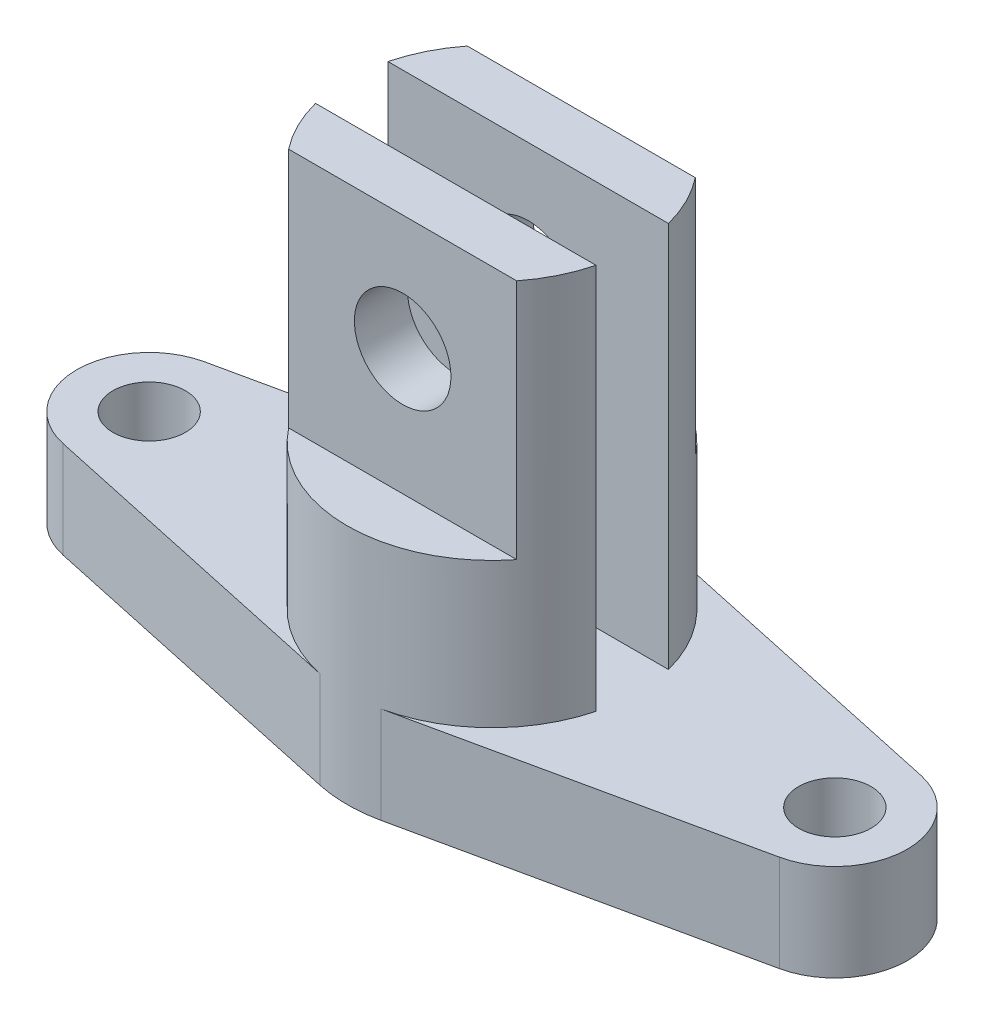
ISO-10303-21;
HEADER;
FILE_DESCRIPTION(('STEP AP214'),'2;1');
FILE_NAME('part.step','',(''),(''),'','','');
FILE_SCHEMA(('AUTOMOTIVE_DESIGN { 1 0 10303 214 1 1 1 1 }'));
ENDSEC;
DATA;
#1=APPLICATION_CONTEXT('core data for automotive mechanical design processes');
#2=APPLICATION_PROTOCOL_DEFINITION('international standard','automotive_design',2000,#1);
#3=PRODUCT_CONTEXT('',#1,'mechanical');
#4=PRODUCT('Part','Part','',(#3));
#5=PRODUCT_RELATED_PRODUCT_CATEGORY('part','',(#4));
#6=PRODUCT_DEFINITION_FORMATION('','',#4);
#7=PRODUCT_DEFINITION_CONTEXT('part definition',#1,'design');
#8=PRODUCT_DEFINITION('design','',#6,#7);
#9=PRODUCT_DEFINITION_SHAPE('','',#8);
#10=(LENGTH_UNIT() NAMED_UNIT(*) SI_UNIT(.MILLI.,.METRE.));
#11=(NAMED_UNIT(*) PLANE_ANGLE_UNIT() SI_UNIT($,.RADIAN.));
#12=(NAMED_UNIT(*) SI_UNIT($,.STERADIAN.) SOLID_ANGLE_UNIT());
#13=UNCERTAINTY_MEASURE_WITH_UNIT(LENGTH_MEASURE(1.E-05),#10,'distance_accuracy_value','');
#14=(GEOMETRIC_REPRESENTATION_CONTEXT(3) GLOBAL_UNCERTAINTY_ASSIGNED_CONTEXT((#13)) GLOBAL_UNIT_ASSIGNED_CONTEXT((#10,
#11,#12)) REPRESENTATION_CONTEXT('',''));
#15=CARTESIAN_POINT('',(0.,0.,0.));
#16=DIRECTION('',(0.,0.,1.));
#17=DIRECTION('',(1.,0.,0.));
#18=AXIS2_PLACEMENT_3D('',#15,#16,#17);
#19=CARTESIAN_POINT('',(-71.,20.,0.));
#20=DIRECTION('',(0.,1.,0.));
#21=DIRECTION('',(0.,0.,1.));
#22=AXIS2_PLACEMENT_3D('',#19,#20,#21);
#23=PLANE('',#22);
#24=DIRECTION('',(1.,0.,0.));
#25=VECTOR('',#24,1.);
#26=CARTESIAN_POINT('',(0.,20.,-7.5));
#27=LINE('',#26,#25);
#28=CARTESIAN_POINT('',(-29.0473750965556,20.,-7.5));
#29=VERTEX_POINT('',#28);
#30=CARTESIAN_POINT('',(29.0473750965556,20.,-7.5));
#31=VERTEX_POINT('',#30);
#32=EDGE_CURVE('E231',#29,#31,#27,.T.);
#33=ORIENTED_EDGE('',*,*,#32,.F.);
#34=CARTESIAN_POINT('',(0.,20.,0.));
#35=DIRECTION('',(0.,1.,0.));
#36=DIRECTION('',(0.,0.,1.));
#37=AXIS2_PLACEMENT_3D('',#34,#35,#36);
#38=CIRCLE('',#37,30.);
#39=CARTESIAN_POINT('',(-6.33802816901409,20.,-29.3228477288408));
#40=VERTEX_POINT('',#39);
#41=EDGE_CURVE('E167',#40,#29,#38,.T.);
#42=ORIENTED_EDGE('',*,*,#41,.F.);
#43=DIRECTION('',(-0.977428257628027,0.,0.211267605633803));
#44=VECTOR('',#43,1.);
#45=CARTESIAN_POINT('',(-6.33802816901409,20.,-29.3228477288408));
#46=LINE('',#45,#44);
#47=CARTESIAN_POINT('',(-74.169014084507,20.,-14.6614238644204));
#48=VERTEX_POINT('',#47);
#49=EDGE_CURVE('E291',#40,#48,#46,.T.);
#50=ORIENTED_EDGE('',*,*,#49,.T.);
#51=CARTESIAN_POINT('',(-71.,20.,0.));
#52=DIRECTION('',(0.,1.,0.));
#53=DIRECTION('',(0.,0.,1.));
#54=AXIS2_PLACEMENT_3D('',#51,#52,#53);
#55=CIRCLE('',#54,15.);
#56=CARTESIAN_POINT('',(-74.169014084507,20.,14.6614238644204));
#57=VERTEX_POINT('',#56);
#58=EDGE_CURVE('E273',#48,#57,#55,.T.);
#59=ORIENTED_EDGE('',*,*,#58,.T.);
#60=DIRECTION('',(0.977428257628027,0.,0.211267605633803));
#61=VECTOR('',#60,1.);
#62=CARTESIAN_POINT('',(-74.169014084507,20.,14.6614238644204));
#63=LINE('',#62,#61);
#64=CARTESIAN_POINT('',(-6.33802816901409,20.,29.3228477288408));
#65=VERTEX_POINT('',#64);
#66=EDGE_CURVE('E277',#57,#65,#63,.T.);
#67=ORIENTED_EDGE('',*,*,#66,.T.);
#68=CARTESIAN_POINT('',(0.,20.,0.));
#69=DIRECTION('',(0.,1.,0.));
#70=DIRECTION('',(0.,0.,1.));
#71=AXIS2_PLACEMENT_3D('',#68,#69,#70);
#72=CIRCLE('',#71,30.);
#73=CARTESIAN_POINT('',(-29.0473750965556,20.,7.5));
#74=VERTEX_POINT('',#73);
#75=EDGE_CURVE('E53',#74,#65,#72,.T.);
#76=ORIENTED_EDGE('',*,*,#75,.F.);
#77=DIRECTION('',(1.,0.,0.));
#78=VECTOR('',#77,1.);
#79=CARTESIAN_POINT('',(0.,20.,7.5));
#80=LINE('',#79,#78);
#81=CARTESIAN_POINT('',(29.0473750965556,20.,7.5));
#82=VERTEX_POINT('',#81);
#83=EDGE_CURVE('E245',#74,#82,#80,.T.);
#84=ORIENTED_EDGE('',*,*,#83,.T.);
#85=CARTESIAN_POINT('',(6.3380281690141,20.,29.3228477288408));
#86=VERTEX_POINT('',#85);
#87=EDGE_CURVE('E11',#86,#82,#72,.T.);
#88=ORIENTED_EDGE('',*,*,#87,.F.);
#89=DIRECTION('',(0.977428257628026,0.,-0.211267605633803));
#90=VECTOR('',#89,1.);
#91=CARTESIAN_POINT('',(74.169014084507,20.,14.6614238644204));
#92=LINE('',#91,#90);
#93=CARTESIAN_POINT('',(74.169014084507,20.,14.6614238644204));
#94=VERTEX_POINT('',#93);
#95=EDGE_CURVE('E282',#86,#94,#92,.T.);
#96=ORIENTED_EDGE('',*,*,#95,.T.);
#97=CARTESIAN_POINT('',(71.,20.,0.));
#98=DIRECTION('',(0.,1.,0.));
#99=DIRECTION('',(0.,0.,-1.));
#100=AXIS2_PLACEMENT_3D('',#97,#98,#99);
#101=CIRCLE('',#100,15.);
#102=CARTESIAN_POINT('',(74.169014084507,20.,-14.6614238644204));
#103=VERTEX_POINT('',#102);
#104=EDGE_CURVE('E285',#94,#103,#101,.T.);
#105=ORIENTED_EDGE('',*,*,#104,.T.);
#106=DIRECTION('',(-0.977428257628027,0.,-0.211267605633802));
#107=VECTOR('',#106,1.);
#108=CARTESIAN_POINT('',(74.169014084507,20.,-14.6614238644204));
#109=LINE('',#108,#107);
#110=CARTESIAN_POINT('',(6.33802816901407,20.,-29.3228477288408));
#111=VERTEX_POINT('',#110);
#112=EDGE_CURVE('E288',#103,#111,#109,.T.);
#113=ORIENTED_EDGE('',*,*,#112,.T.);
#114=EDGE_CURVE('E234',#31,#111,#38,.T.);
#115=ORIENTED_EDGE('',*,*,#114,.F.);
#116=EDGE_LOOP('',(#33,#42,#50,#59,#67,#76,#84,#88,#96,#105,#113,#115));
#117=FACE_BOUND('',#116,.T.);
#118=CARTESIAN_POINT('',(-71.,20.,0.));
#119=DIRECTION('',(0.,1.,0.));
#120=DIRECTION('',(0.,0.,1.));
#121=AXIS2_PLACEMENT_3D('',#118,#119,#120);
#122=CIRCLE('',#121,7.50000000000001);
#123=CARTESIAN_POINT('',(-71.,20.,7.50000000000001));
#124=VERTEX_POINT('',#123);
#125=EDGE_CURVE('E265',#124,#124,#122,.T.);
#126=ORIENTED_EDGE('',*,*,#125,.F.);
#127=EDGE_LOOP('',(#126));
#128=FACE_BOUND('',#127,.T.);
#129=CARTESIAN_POINT('',(71.,20.,0.));
#130=DIRECTION('',(0.,1.,0.));
#131=DIRECTION('',(0.,0.,1.));
#132=AXIS2_PLACEMENT_3D('',#129,#130,#131);
#133=CIRCLE('',#132,7.50000000000001);
#134=CARTESIAN_POINT('',(71.,20.,7.49999999999999));
#135=VERTEX_POINT('',#134);
#136=EDGE_CURVE('E257',#135,#135,#133,.T.);
#137=ORIENTED_EDGE('',*,*,#136,.F.);
#138=EDGE_LOOP('',(#137));
#139=FACE_BOUND('',#138,.T.);
#140=ADVANCED_FACE('F41',(#117,#128,#139),#23,.T.);
#141=CARTESIAN_POINT('',(-71.,0.,0.));
#142=DIRECTION('',(0.,1.,0.));
#143=DIRECTION('',(0.,0.,1.));
#144=AXIS2_PLACEMENT_3D('',#141,#142,#143);
#145=PLANE('',#144);
#146=CARTESIAN_POINT('',(-71.,0.,0.));
#147=DIRECTION('',(0.,1.,0.));
#148=DIRECTION('',(0.,0.,1.));
#149=AXIS2_PLACEMENT_3D('',#146,#147,#148);
#150=CIRCLE('',#149,15.);
#151=CARTESIAN_POINT('',(-74.169014084507,0.,-14.6614238644204));
#152=VERTEX_POINT('',#151);
#153=CARTESIAN_POINT('',(-74.169014084507,0.,14.6614238644204));
#154=VERTEX_POINT('',#153);
#155=EDGE_CURVE('E269',#152,#154,#150,.T.);
#156=ORIENTED_EDGE('',*,*,#155,.F.);
#157=DIRECTION('',(-0.977428257628027,0.,0.211267605633803));
#158=VECTOR('',#157,1.);
#159=CARTESIAN_POINT('',(-6.33802816901409,0.,-29.3228477288408));
#160=LINE('',#159,#158);
#161=CARTESIAN_POINT('',(-6.33802816901409,0.,-29.3228477288408));
#162=VERTEX_POINT('',#161);
#163=EDGE_CURVE('E278',#162,#152,#160,.T.);
#164=ORIENTED_EDGE('',*,*,#163,.F.);
#165=CARTESIAN_POINT('',(0.,0.,0.));
#166=DIRECTION('',(0.,1.,0.));
#167=DIRECTION('',(0.,0.,1.));
#168=AXIS2_PLACEMENT_3D('',#165,#166,#167);
#169=CIRCLE('',#168,30.);
#170=CARTESIAN_POINT('',(6.33802816901407,0.,-29.3228477288408));
#171=VERTEX_POINT('',#170);
#172=EDGE_CURVE('E313',#171,#162,#169,.T.);
#173=ORIENTED_EDGE('',*,*,#172,.F.);
#174=DIRECTION('',(-0.977428257628027,0.,-0.211267605633802));
#175=VECTOR('',#174,1.);
#176=CARTESIAN_POINT('',(74.169014084507,0.,-14.6614238644204));
#177=LINE('',#176,#175);
#178=CARTESIAN_POINT('',(74.169014084507,0.,-14.6614238644204));
#179=VERTEX_POINT('',#178);
#180=EDGE_CURVE('E310',#179,#171,#177,.T.);
#181=ORIENTED_EDGE('',*,*,#180,.F.);
#182=CARTESIAN_POINT('',(71.,0.,0.));
#183=DIRECTION('',(0.,1.,0.));
#184=DIRECTION('',(0.,0.,-1.));
#185=AXIS2_PLACEMENT_3D('',#182,#183,#184);
#186=CIRCLE('',#185,15.);
#187=CARTESIAN_POINT('',(74.169014084507,0.,14.6614238644204));
#188=VERTEX_POINT('',#187);
#189=EDGE_CURVE('E307',#188,#179,#186,.T.);
#190=ORIENTED_EDGE('',*,*,#189,.F.);
#191=DIRECTION('',(0.977428257628026,0.,-0.211267605633803));
#192=VECTOR('',#191,1.);
#193=CARTESIAN_POINT('',(74.169014084507,0.,14.6614238644204));
#194=LINE('',#193,#192);
#195=CARTESIAN_POINT('',(6.3380281690141,0.,29.3228477288408));
#196=VERTEX_POINT('',#195);
#197=EDGE_CURVE('E304',#196,#188,#194,.T.);
#198=ORIENTED_EDGE('',*,*,#197,.F.);
#199=CARTESIAN_POINT('',(0.,0.,0.));
#200=DIRECTION('',(0.,1.,0.));
#201=DIRECTION('',(0.,0.,1.));
#202=AXIS2_PLACEMENT_3D('',#199,#200,#201);
#203=CIRCLE('',#202,30.);
#204=CARTESIAN_POINT('',(-6.33802816901409,0.,29.3228477288408));
#205=VERTEX_POINT('',#204);
#206=EDGE_CURVE('E301',#205,#196,#203,.T.);
#207=ORIENTED_EDGE('',*,*,#206,.F.);
#208=DIRECTION('',(0.977428257628027,0.,0.211267605633803));
#209=VECTOR('',#208,1.);
#210=CARTESIAN_POINT('',(-74.169014084507,0.,14.6614238644204));
#211=LINE('',#210,#209);
#212=EDGE_CURVE('E298',#154,#205,#211,.T.);
#213=ORIENTED_EDGE('',*,*,#212,.F.);
#214=EDGE_LOOP('',(#156,#164,#173,#181,#190,#198,#207,#213));
#215=FACE_BOUND('',#214,.T.);
#216=CARTESIAN_POINT('',(-71.,0.,0.));
#217=DIRECTION('',(0.,1.,0.));
#218=DIRECTION('',(0.,0.,1.));
#219=AXIS2_PLACEMENT_3D('',#216,#217,#218);
#220=CIRCLE('',#219,7.50000000000001);
#221=CARTESIAN_POINT('',(-71.,0.,7.50000000000001));
#222=VERTEX_POINT('',#221);
#223=EDGE_CURVE('E261',#222,#222,#220,.T.);
#224=ORIENTED_EDGE('',*,*,#223,.T.);
#225=EDGE_LOOP('',(#224));
#226=FACE_BOUND('',#225,.T.);
#227=CARTESIAN_POINT('',(71.,0.,0.));
#228=DIRECTION('',(0.,1.,0.));
#229=DIRECTION('',(0.,0.,1.));
#230=AXIS2_PLACEMENT_3D('',#227,#228,#229);
#231=CIRCLE('',#230,7.50000000000001);
#232=CARTESIAN_POINT('',(71.,0.,7.49999999999999));
#233=VERTEX_POINT('',#232);
#234=EDGE_CURVE('E256',#233,#233,#231,.T.);
#235=ORIENTED_EDGE('',*,*,#234,.T.);
#236=EDGE_LOOP('',(#235));
#237=FACE_BOUND('',#236,.T.);
#238=ADVANCED_FACE('F356',(#215,#226,#237),#145,.F.);
#239=CARTESIAN_POINT('',(-71.,20.,0.));
#240=DIRECTION('',(0.,-1.,0.));
#241=DIRECTION('',(0.,0.,-1.));
#242=AXIS2_PLACEMENT_3D('',#239,#240,#241);
#243=CYLINDRICAL_SURFACE('',#242,15.);
#244=ORIENTED_EDGE('',*,*,#155,.T.);
#245=DIRECTION('',(0.,-1.,0.));
#246=VECTOR('',#245,1.);
#247=CARTESIAN_POINT('',(-74.169014084507,20.,14.6614238644204));
#248=LINE('',#247,#246);
#249=EDGE_CURVE('E51',#57,#154,#248,.T.);
#250=ORIENTED_EDGE('',*,*,#249,.F.);
#251=ORIENTED_EDGE('',*,*,#58,.F.);
#252=DIRECTION('',(0.,-1.,0.));
#253=VECTOR('',#252,1.);
#254=CARTESIAN_POINT('',(-74.169014084507,20.,-14.6614238644204));
#255=LINE('',#254,#253);
#256=EDGE_CURVE('E294',#48,#152,#255,.T.);
#257=ORIENTED_EDGE('',*,*,#256,.T.);
#258=EDGE_LOOP('',(#244,#250,#251,#257));
#259=FACE_BOUND('',#258,.T.);
#260=ADVANCED_FACE('F43',(#259),#243,.T.);
#261=CARTESIAN_POINT('',(-74.169014084507,20.,14.6614238644204));
#262=DIRECTION('',(0.211267605633803,0.,-0.977428257628027));
#263=DIRECTION('',(-0.977428257628027,0.,-0.211267605633803));
#264=AXIS2_PLACEMENT_3D('',#261,#262,#263);
#265=PLANE('',#264);
#266=ORIENTED_EDGE('',*,*,#212,.T.);
#267=DIRECTION('',(0.,-1.,0.));
#268=VECTOR('',#267,1.);
#269=CARTESIAN_POINT('',(-6.33802816901409,20.,29.3228477288408));
#270=LINE('',#269,#268);
#271=EDGE_CURVE('E341',#65,#205,#270,.T.);
#272=ORIENTED_EDGE('',*,*,#271,.F.);
#273=ORIENTED_EDGE('',*,*,#66,.F.);
#274=ORIENTED_EDGE('',*,*,#249,.T.);
#275=EDGE_LOOP('',(#266,#272,#273,#274));
#276=FACE_BOUND('',#275,.T.);
#277=ADVANCED_FACE('F348',(#276),#265,.F.);
#278=CARTESIAN_POINT('',(0.,20.,0.));
#279=DIRECTION('',(0.,-1.,0.));
#280=DIRECTION('',(0.,0.,-1.));
#281=AXIS2_PLACEMENT_3D('',#278,#279,#280);
#282=CYLINDRICAL_SURFACE('',#281,30.);
#283=ORIENTED_EDGE('',*,*,#206,.T.);
#284=DIRECTION('',(0.,-1.,0.));
#285=VECTOR('',#284,1.);
#286=CARTESIAN_POINT('',(6.3380281690141,20.,29.3228477288408));
#287=LINE('',#286,#285);
#288=EDGE_CURVE('E337',#86,#196,#287,.T.);
#289=ORIENTED_EDGE('',*,*,#288,.F.);
#290=ORIENTED_EDGE('',*,*,#87,.T.);
#291=DIRECTION('',(0.,-1.,0.));
#292=VECTOR('',#291,1.);
#293=CARTESIAN_POINT('',(29.0473750965556,50.,7.5));
#294=LINE('',#293,#292);
#295=CARTESIAN_POINT('',(29.0473750965556,100.,7.5));
#296=VERTEX_POINT('',#295);
#297=EDGE_CURVE('E253',#296,#82,#294,.T.);
#298=ORIENTED_EDGE('',*,*,#297,.F.);
#299=CARTESIAN_POINT('',(0.,100.,0.));
#300=DIRECTION('',(0.,1.,0.));
#301=DIRECTION('',(0.,0.,1.));
#302=AXIS2_PLACEMENT_3D('',#299,#300,#301);
#303=CIRCLE('',#302,30.);
#304=CARTESIAN_POINT('',(23.6167313572391,100.,18.5));
#305=VERTEX_POINT('',#304);
#306=EDGE_CURVE('E213',#305,#296,#303,.T.);
#307=ORIENTED_EDGE('',*,*,#306,.F.);
#308=DIRECTION('',(0.,-1.,0.));
#309=VECTOR('',#308,1.);
#310=CARTESIAN_POINT('',(23.6167313572391,100.,18.5));
#311=LINE('',#310,#309);
#312=CARTESIAN_POINT('',(23.6167313572391,50.,18.5));
#313=VERTEX_POINT('',#312);
#314=EDGE_CURVE('E221',#305,#313,#311,.T.);
#315=ORIENTED_EDGE('',*,*,#314,.T.);
#316=CARTESIAN_POINT('',(0.,50.,0.));
#317=DIRECTION('',(0.,1.,0.));
#318=DIRECTION('',(0.,0.,1.));
#319=AXIS2_PLACEMENT_3D('',#316,#317,#318);
#320=CIRCLE('',#319,30.);
#321=CARTESIAN_POINT('',(-23.6167313572391,50.,18.5));
#322=VERTEX_POINT('',#321);
#323=EDGE_CURVE('E242',#322,#313,#320,.T.);
#324=ORIENTED_EDGE('',*,*,#323,.F.);
#325=DIRECTION('',(0.,-1.,0.));
#326=VECTOR('',#325,1.);
#327=CARTESIAN_POINT('',(-23.6167313572391,100.,18.5));
#328=LINE('',#327,#326);
#329=CARTESIAN_POINT('',(-23.6167313572391,100.,18.5));
#330=VERTEX_POINT('',#329);
#331=EDGE_CURVE('E227',#330,#322,#328,.T.);
#332=ORIENTED_EDGE('',*,*,#331,.F.);
#333=CARTESIAN_POINT('',(0.,100.,0.));
#334=DIRECTION('',(0.,1.,0.));
#335=DIRECTION('',(0.,0.,1.));
#336=AXIS2_PLACEMENT_3D('',#333,#334,#335);
#337=CIRCLE('',#336,30.);
#338=CARTESIAN_POINT('',(-29.0473750965556,100.,7.5));
#339=VERTEX_POINT('',#338);
#340=EDGE_CURVE('E206',#339,#330,#337,.T.);
#341=ORIENTED_EDGE('',*,*,#340,.F.);
#342=DIRECTION('',(0.,-1.,0.));
#343=VECTOR('',#342,1.);
#344=CARTESIAN_POINT('',(-29.0473750965556,50.,7.5));
#345=LINE('',#344,#343);
#346=EDGE_CURVE('E244',#339,#74,#345,.T.);
#347=ORIENTED_EDGE('',*,*,#346,.T.);
#348=ORIENTED_EDGE('',*,*,#75,.T.);
#349=ORIENTED_EDGE('',*,*,#271,.T.);
#350=EDGE_LOOP('',(#283,#289,#290,#298,#307,#315,#324,#332,#341,#347,#348,#349));
#351=FACE_BOUND('',#350,.T.);
#352=ADVANCED_FACE('F364',(#351),#282,.T.);
#353=CARTESIAN_POINT('',(74.169014084507,20.,14.6614238644204));
#354=DIRECTION('',(-0.211267605633803,0.,-0.977428257628027));
#355=DIRECTION('',(-0.977428257628027,0.,0.211267605633803));
#356=AXIS2_PLACEMENT_3D('',#353,#354,#355);
#357=PLANE('',#356);
#358=ORIENTED_EDGE('',*,*,#197,.T.);
#359=DIRECTION('',(0.,-1.,0.));
#360=VECTOR('',#359,1.);
#361=CARTESIAN_POINT('',(74.169014084507,20.,14.6614238644204));
#362=LINE('',#361,#360);
#363=EDGE_CURVE('E333',#94,#188,#362,.T.);
#364=ORIENTED_EDGE('',*,*,#363,.F.);
#365=ORIENTED_EDGE('',*,*,#95,.F.);
#366=ORIENTED_EDGE('',*,*,#288,.T.);
#367=EDGE_LOOP('',(#358,#364,#365,#366));
#368=FACE_BOUND('',#367,.T.);
#369=ADVANCED_FACE('F367',(#368),#357,.F.);
#370=CARTESIAN_POINT('',(71.,20.,0.));
#371=DIRECTION('',(0.,-1.,0.));
#372=DIRECTION('',(0.,0.,-1.));
#373=AXIS2_PLACEMENT_3D('',#370,#371,#372);
#374=CYLINDRICAL_SURFACE('',#373,15.);
#375=ORIENTED_EDGE('',*,*,#189,.T.);
#376=DIRECTION('',(0.,-1.,0.));
#377=VECTOR('',#376,1.);
#378=CARTESIAN_POINT('',(74.169014084507,20.,-14.6614238644204));
#379=LINE('',#378,#377);
#380=EDGE_CURVE('E329',#103,#179,#379,.T.);
#381=ORIENTED_EDGE('',*,*,#380,.F.);
#382=ORIENTED_EDGE('',*,*,#104,.F.);
#383=ORIENTED_EDGE('',*,*,#363,.T.);
#384=EDGE_LOOP('',(#375,#381,#382,#383));
#385=FACE_BOUND('',#384,.T.);
#386=ADVANCED_FACE('F417',(#385),#374,.T.);
#387=CARTESIAN_POINT('',(74.169014084507,20.,-14.6614238644204));
#388=DIRECTION('',(-0.211267605633802,0.,0.977428257628027));
#389=DIRECTION('',(0.977428257628027,0.,0.211267605633802));
#390=AXIS2_PLACEMENT_3D('',#387,#388,#389);
#391=PLANE('',#390);
#392=ORIENTED_EDGE('',*,*,#180,.T.);
#393=DIRECTION('',(0.,-1.,0.));
#394=VECTOR('',#393,1.);
#395=CARTESIAN_POINT('',(6.33802816901407,20.,-29.3228477288408));
#396=LINE('',#395,#394);
#397=EDGE_CURVE('E325',#111,#171,#396,.T.);
#398=ORIENTED_EDGE('',*,*,#397,.F.);
#399=ORIENTED_EDGE('',*,*,#112,.F.);
#400=ORIENTED_EDGE('',*,*,#380,.T.);
#401=EDGE_LOOP('',(#392,#398,#399,#400));
#402=FACE_BOUND('',#401,.T.);
#403=ADVANCED_FACE('F414',(#402),#391,.F.);
#404=CARTESIAN_POINT('',(0.,20.,0.));
#405=DIRECTION('',(0.,-1.,0.));
#406=DIRECTION('',(0.,0.,-1.));
#407=AXIS2_PLACEMENT_3D('',#404,#405,#406);
#408=CYLINDRICAL_SURFACE('',#407,30.);
#409=ORIENTED_EDGE('',*,*,#172,.T.);
#410=DIRECTION('',(0.,-1.,0.));
#411=VECTOR('',#410,1.);
#412=CARTESIAN_POINT('',(-6.33802816901409,20.,-29.3228477288408));
#413=LINE('',#412,#411);
#414=EDGE_CURVE('E321',#40,#162,#413,.T.);
#415=ORIENTED_EDGE('',*,*,#414,.F.);
#416=ORIENTED_EDGE('',*,*,#41,.T.);
#417=DIRECTION('',(0.,-1.,0.));
#418=VECTOR('',#417,1.);
#419=CARTESIAN_POINT('',(-29.0473750965556,50.,-7.5));
#420=LINE('',#419,#418);
#421=CARTESIAN_POINT('',(-29.0473750965556,100.,-7.5));
#422=VERTEX_POINT('',#421);
#423=EDGE_CURVE('E159',#422,#29,#420,.T.);
#424=ORIENTED_EDGE('',*,*,#423,.F.);
#425=CARTESIAN_POINT('',(0.,100.,0.));
#426=DIRECTION('',(0.,1.,0.));
#427=DIRECTION('',(0.,0.,1.));
#428=AXIS2_PLACEMENT_3D('',#425,#426,#427);
#429=CIRCLE('',#428,30.);
#430=CARTESIAN_POINT('',(-23.6167313572391,100.,-18.5));
#431=VERTEX_POINT('',#430);
#432=EDGE_CURVE('E164',#431,#422,#429,.T.);
#433=ORIENTED_EDGE('',*,*,#432,.F.);
#434=DIRECTION('',(0.,-1.,0.));
#435=VECTOR('',#434,1.);
#436=CARTESIAN_POINT('',(-23.6167313572391,100.,-18.5));
#437=LINE('',#436,#435);
#438=CARTESIAN_POINT('',(-23.6167313572391,50.,-18.5));
#439=VERTEX_POINT('',#438);
#440=EDGE_CURVE('E198',#431,#439,#437,.T.);
#441=ORIENTED_EDGE('',*,*,#440,.T.);
#442=CARTESIAN_POINT('',(0.,50.,0.));
#443=DIRECTION('',(0.,1.,0.));
#444=DIRECTION('',(0.,0.,1.));
#445=AXIS2_PLACEMENT_3D('',#442,#443,#444);
#446=CIRCLE('',#445,30.);
#447=CARTESIAN_POINT('',(23.6167313572391,50.,-18.5));
#448=VERTEX_POINT('',#447);
#449=EDGE_CURVE('E172',#448,#439,#446,.T.);
#450=ORIENTED_EDGE('',*,*,#449,.F.);
#451=DIRECTION('',(0.,-1.,0.));
#452=VECTOR('',#451,1.);
#453=CARTESIAN_POINT('',(23.6167313572391,100.,-18.5));
#454=LINE('',#453,#452);
#455=CARTESIAN_POINT('',(23.6167313572391,100.,-18.5));
#456=VERTEX_POINT('',#455);
#457=EDGE_CURVE('E202',#456,#448,#454,.T.);
#458=ORIENTED_EDGE('',*,*,#457,.F.);
#459=CARTESIAN_POINT('',(0.,100.,0.));
#460=DIRECTION('',(0.,1.,0.));
#461=DIRECTION('',(0.,0.,1.));
#462=AXIS2_PLACEMENT_3D('',#459,#460,#461);
#463=CIRCLE('',#462,30.);
#464=CARTESIAN_POINT('',(29.0473750965556,100.,-7.5));
#465=VERTEX_POINT('',#464);
#466=EDGE_CURVE('E181',#465,#456,#463,.T.);
#467=ORIENTED_EDGE('',*,*,#466,.F.);
#468=DIRECTION('',(0.,-1.,0.));
#469=VECTOR('',#468,1.);
#470=CARTESIAN_POINT('',(29.0473750965556,50.,-7.5));
#471=LINE('',#470,#469);
#472=EDGE_CURVE('E171',#465,#31,#471,.T.);
#473=ORIENTED_EDGE('',*,*,#472,.T.);
#474=ORIENTED_EDGE('',*,*,#114,.T.);
#475=ORIENTED_EDGE('',*,*,#397,.T.);
#476=EDGE_LOOP('',(#409,#415,#416,#424,#433,#441,#450,#458,#467,#473,#474,#475));
#477=FACE_BOUND('',#476,.T.);
#478=ADVANCED_FACE('F161',(#477),#408,.T.);
#479=CARTESIAN_POINT('',(-6.33802816901409,20.,-29.3228477288408));
#480=DIRECTION('',(0.211267605633803,0.,0.977428257628027));
#481=DIRECTION('',(0.977428257628027,0.,-0.211267605633803));
#482=AXIS2_PLACEMENT_3D('',#479,#480,#481);
#483=PLANE('',#482);
#484=ORIENTED_EDGE('',*,*,#163,.T.);
#485=ORIENTED_EDGE('',*,*,#256,.F.);
#486=ORIENTED_EDGE('',*,*,#49,.F.);
#487=ORIENTED_EDGE('',*,*,#414,.T.);
#488=EDGE_LOOP('',(#484,#485,#486,#487));
#489=FACE_BOUND('',#488,.T.);
#490=ADVANCED_FACE('F408',(#489),#483,.F.);
#491=CARTESIAN_POINT('',(-71.,20.,0.));
#492=DIRECTION('',(0.,-1.,0.));
#493=DIRECTION('',(0.,0.,-1.));
#494=AXIS2_PLACEMENT_3D('',#491,#492,#493);
#495=CYLINDRICAL_SURFACE('',#494,7.50000000000001);
#496=ORIENTED_EDGE('',*,*,#125,.T.);
#497=EDGE_LOOP('',(#496));
#498=FACE_BOUND('',#497,.T.);
#499=ORIENTED_EDGE('',*,*,#223,.F.);
#500=EDGE_LOOP('',(#499));
#501=FACE_BOUND('',#500,.T.);
#502=ADVANCED_FACE('F405',(#498,#501),#495,.F.);
#503=CARTESIAN_POINT('',(71.,20.,0.));
#504=DIRECTION('',(0.,-1.,0.));
#505=DIRECTION('',(0.,0.,-1.));
#506=AXIS2_PLACEMENT_3D('',#503,#504,#505);
#507=CYLINDRICAL_SURFACE('',#506,7.50000000000001);
#508=ORIENTED_EDGE('',*,*,#136,.T.);
#509=EDGE_LOOP('',(#508));
#510=FACE_BOUND('',#509,.T.);
#511=ORIENTED_EDGE('',*,*,#234,.F.);
#512=EDGE_LOOP('',(#511));
#513=FACE_BOUND('',#512,.T.);
#514=ADVANCED_FACE('F490',(#510,#513),#507,.F.);
#515=CARTESIAN_POINT('',(0.,50.,7.5));
#516=DIRECTION('',(0.,0.,-1.));
#517=DIRECTION('',(-1.,0.,0.));
#518=AXIS2_PLACEMENT_3D('',#515,#516,#517);
#519=PLANE('',#518);
#520=CARTESIAN_POINT('',(0.,76.,7.5));
#521=DIRECTION('',(0.,0.,-1.));
#522=DIRECTION('',(-1.,0.,0.));
#523=AXIS2_PLACEMENT_3D('',#520,#521,#522);
#524=CIRCLE('',#523,10.);
#525=CARTESIAN_POINT('',(-10.,76.,7.5));
#526=VERTEX_POINT('',#525);
#527=EDGE_CURVE('E190',#526,#526,#524,.T.);
#528=ORIENTED_EDGE('',*,*,#527,.F.);
#529=EDGE_LOOP('',(#528));
#530=FACE_BOUND('',#529,.T.);
#531=ORIENTED_EDGE('',*,*,#83,.F.);
#532=ORIENTED_EDGE('',*,*,#346,.F.);
#533=DIRECTION('',(-1.,0.,0.));
#534=VECTOR('',#533,1.);
#535=CARTESIAN_POINT('',(29.0473750965556,100.,7.5));
#536=LINE('',#535,#534);
#537=EDGE_CURVE('E217',#296,#339,#536,.T.);
#538=ORIENTED_EDGE('',*,*,#537,.F.);
#539=ORIENTED_EDGE('',*,*,#297,.T.);
#540=EDGE_LOOP('',(#531,#532,#538,#539));
#541=FACE_BOUND('',#540,.T.);
#542=ADVANCED_FACE('F382',(#530,#541),#519,.T.);
#543=CARTESIAN_POINT('',(0.,50.,0.));
#544=DIRECTION('',(0.,1.,0.));
#545=DIRECTION('',(0.,0.,1.));
#546=AXIS2_PLACEMENT_3D('',#543,#544,#545);
#547=PLANE('',#546);
#548=DIRECTION('',(1.,0.,0.));
#549=VECTOR('',#548,1.);
#550=CARTESIAN_POINT('',(-23.6167313572391,50.,18.5));
#551=LINE('',#550,#549);
#552=EDGE_CURVE('E66',#322,#313,#551,.T.);
#553=ORIENTED_EDGE('',*,*,#552,.F.);
#554=ORIENTED_EDGE('',*,*,#323,.T.);
#555=EDGE_LOOP('',(#553,#554));
#556=FACE_BOUND('',#555,.T.);
#557=ADVANCED_FACE('F506',(#556),#547,.T.);
#558=CARTESIAN_POINT('',(0.,50.,-7.5));
#559=DIRECTION('',(0.,0.,-1.));
#560=DIRECTION('',(-1.,0.,0.));
#561=AXIS2_PLACEMENT_3D('',#558,#559,#560);
#562=PLANE('',#561);
#563=CARTESIAN_POINT('',(0.,76.,-7.5));
#564=DIRECTION('',(0.,0.,-1.));
#565=DIRECTION('',(-1.,0.,0.));
#566=AXIS2_PLACEMENT_3D('',#563,#564,#565);
#567=CIRCLE('',#566,10.);
#568=CARTESIAN_POINT('',(-10.,76.,-7.5));
#569=VERTEX_POINT('',#568);
#570=EDGE_CURVE('E583',#569,#569,#567,.T.);
#571=ORIENTED_EDGE('',*,*,#570,.T.);
#572=EDGE_LOOP('',(#571));
#573=FACE_BOUND('',#572,.T.);
#574=ORIENTED_EDGE('',*,*,#32,.T.);
#575=ORIENTED_EDGE('',*,*,#472,.F.);
#576=DIRECTION('',(1.,0.,0.));
#577=VECTOR('',#576,1.);
#578=CARTESIAN_POINT('',(-29.0473750965556,100.,-7.5));
#579=LINE('',#578,#577);
#580=EDGE_CURVE('E175',#422,#465,#579,.T.);
#581=ORIENTED_EDGE('',*,*,#580,.F.);
#582=ORIENTED_EDGE('',*,*,#423,.T.);
#583=EDGE_LOOP('',(#574,#575,#581,#582));
#584=FACE_BOUND('',#583,.T.);
#585=ADVANCED_FACE('F176',(#573,#584),#562,.F.);
#586=CARTESIAN_POINT('',(0.,50.,0.));
#587=DIRECTION('',(0.,1.,0.));
#588=DIRECTION('',(0.,0.,1.));
#589=AXIS2_PLACEMENT_3D('',#586,#587,#588);
#590=PLANE('',#589);
#591=DIRECTION('',(-1.,0.,0.));
#592=VECTOR('',#591,1.);
#593=CARTESIAN_POINT('',(-23.6167313572391,50.,-18.5));
#594=LINE('',#593,#592);
#595=EDGE_CURVE('E59',#448,#439,#594,.T.);
#596=ORIENTED_EDGE('',*,*,#595,.F.);
#597=ORIENTED_EDGE('',*,*,#449,.T.);
#598=EDGE_LOOP('',(#596,#597));
#599=FACE_BOUND('',#598,.T.);
#600=ADVANCED_FACE('F387',(#599),#590,.T.);
#601=CARTESIAN_POINT('',(-23.6167313572391,100.,18.5));
#602=DIRECTION('',(0.,0.,-1.));
#603=DIRECTION('',(-1.,0.,0.));
#604=AXIS2_PLACEMENT_3D('',#601,#602,#603);
#605=PLANE('',#604);
#606=CARTESIAN_POINT('',(0.,76.,18.5));
#607=DIRECTION('',(0.,0.,1.));
#608=DIRECTION('',(1.,0.,0.));
#609=AXIS2_PLACEMENT_3D('',#606,#607,#608);
#610=CIRCLE('',#609,10.);
#611=CARTESIAN_POINT('',(10.,76.,18.5));
#612=VERTEX_POINT('',#611);
#613=EDGE_CURVE('E584',#612,#612,#610,.T.);
#614=ORIENTED_EDGE('',*,*,#613,.F.);
#615=EDGE_LOOP('',(#614));
#616=FACE_BOUND('',#615,.T.);
#617=ORIENTED_EDGE('',*,*,#552,.T.);
#618=ORIENTED_EDGE('',*,*,#314,.F.);
#619=DIRECTION('',(1.,0.,0.));
#620=VECTOR('',#619,1.);
#621=CARTESIAN_POINT('',(-23.6167313572391,100.,18.5));
#622=LINE('',#621,#620);
#623=EDGE_CURVE('E210',#330,#305,#622,.T.);
#624=ORIENTED_EDGE('',*,*,#623,.F.);
#625=ORIENTED_EDGE('',*,*,#331,.T.);
#626=EDGE_LOOP('',(#617,#618,#624,#625));
#627=FACE_BOUND('',#626,.T.);
#628=ADVANCED_FACE('F385',(#616,#627),#605,.F.);
#629=CARTESIAN_POINT('',(0.,100.,0.));
#630=DIRECTION('',(0.,1.,0.));
#631=DIRECTION('',(0.,0.,1.));
#632=AXIS2_PLACEMENT_3D('',#629,#630,#631);
#633=PLANE('',#632);
#634=ORIENTED_EDGE('',*,*,#340,.T.);
#635=ORIENTED_EDGE('',*,*,#623,.T.);
#636=ORIENTED_EDGE('',*,*,#306,.T.);
#637=ORIENTED_EDGE('',*,*,#537,.T.);
#638=EDGE_LOOP('',(#634,#635,#636,#637));
#639=FACE_BOUND('',#638,.T.);
#640=ADVANCED_FACE('F379',(#639),#633,.T.);
#641=CARTESIAN_POINT('',(-23.6167313572391,100.,-18.5));
#642=DIRECTION('',(0.,0.,1.));
#643=DIRECTION('',(1.,0.,0.));
#644=AXIS2_PLACEMENT_3D('',#641,#642,#643);
#645=PLANE('',#644);
#646=CARTESIAN_POINT('',(0.,76.,-18.5));
#647=DIRECTION('',(0.,0.,1.));
#648=DIRECTION('',(1.,0.,0.));
#649=AXIS2_PLACEMENT_3D('',#646,#647,#648);
#650=CIRCLE('',#649,10.);
#651=CARTESIAN_POINT('',(10.,76.,-18.5));
#652=VERTEX_POINT('',#651);
#653=EDGE_CURVE('E45',#652,#652,#650,.T.);
#654=ORIENTED_EDGE('',*,*,#653,.T.);
#655=EDGE_LOOP('',(#654));
#656=FACE_BOUND('',#655,.T.);
#657=ORIENTED_EDGE('',*,*,#595,.T.);
#658=ORIENTED_EDGE('',*,*,#440,.F.);
#659=DIRECTION('',(-1.,0.,0.));
#660=VECTOR('',#659,1.);
#661=CARTESIAN_POINT('',(-23.6167313572391,100.,-18.5));
#662=LINE('',#661,#660);
#663=EDGE_CURVE('E185',#456,#431,#662,.T.);
#664=ORIENTED_EDGE('',*,*,#663,.F.);
#665=ORIENTED_EDGE('',*,*,#457,.T.);
#666=EDGE_LOOP('',(#657,#658,#664,#665));
#667=FACE_BOUND('',#666,.T.);
#668=ADVANCED_FACE('F394',(#656,#667),#645,.F.);
#669=CARTESIAN_POINT('',(0.,100.,0.));
#670=DIRECTION('',(0.,1.,0.));
#671=DIRECTION('',(0.,0.,1.));
#672=AXIS2_PLACEMENT_3D('',#669,#670,#671);
#673=PLANE('',#672);
#674=ORIENTED_EDGE('',*,*,#432,.T.);
#675=ORIENTED_EDGE('',*,*,#580,.T.);
#676=ORIENTED_EDGE('',*,*,#466,.T.);
#677=ORIENTED_EDGE('',*,*,#663,.T.);
#678=EDGE_LOOP('',(#674,#675,#676,#677));
#679=FACE_BOUND('',#678,.T.);
#680=ADVANCED_FACE('F183',(#679),#673,.T.);
#681=CARTESIAN_POINT('',(0.,76.,-31.5));
#682=DIRECTION('',(0.,0.,1.));
#683=DIRECTION('',(1.,0.,0.));
#684=AXIS2_PLACEMENT_3D('',#681,#682,#683);
#685=CYLINDRICAL_SURFACE('',#684,10.);
#686=ORIENTED_EDGE('',*,*,#653,.F.);
#687=EDGE_LOOP('',(#686));
#688=FACE_BOUND('',#687,.T.);
#689=ORIENTED_EDGE('',*,*,#570,.F.);
#690=EDGE_LOOP('',(#689));
#691=FACE_BOUND('',#690,.T.);
#692=ADVANCED_FACE('F545',(#688,#691),#685,.F.);
#693=ORIENTED_EDGE('',*,*,#527,.T.);
#694=EDGE_LOOP('',(#693));
#695=FACE_BOUND('',#694,.T.);
#696=ORIENTED_EDGE('',*,*,#613,.T.);
#697=EDGE_LOOP('',(#696));
#698=FACE_BOUND('',#697,.T.);
#699=ADVANCED_FACE('F557',(#695,#698),#685,.F.);
#700=CLOSED_SHELL('',(#140,#238,#260,#277,#352,#369,#386,#403,#478,#490,#502,#514,#542,#557,
#585,#600,#628,#640,#668,#680,#692,#699));
#701=MANIFOLD_SOLID_BREP('B2',#700);
#702=ADVANCED_BREP_SHAPE_REPRESENTATION('',(#18,#701),#14);
#703=SHAPE_DEFINITION_REPRESENTATION(#9,#702);
ENDSEC;
END-ISO-10303-21;
